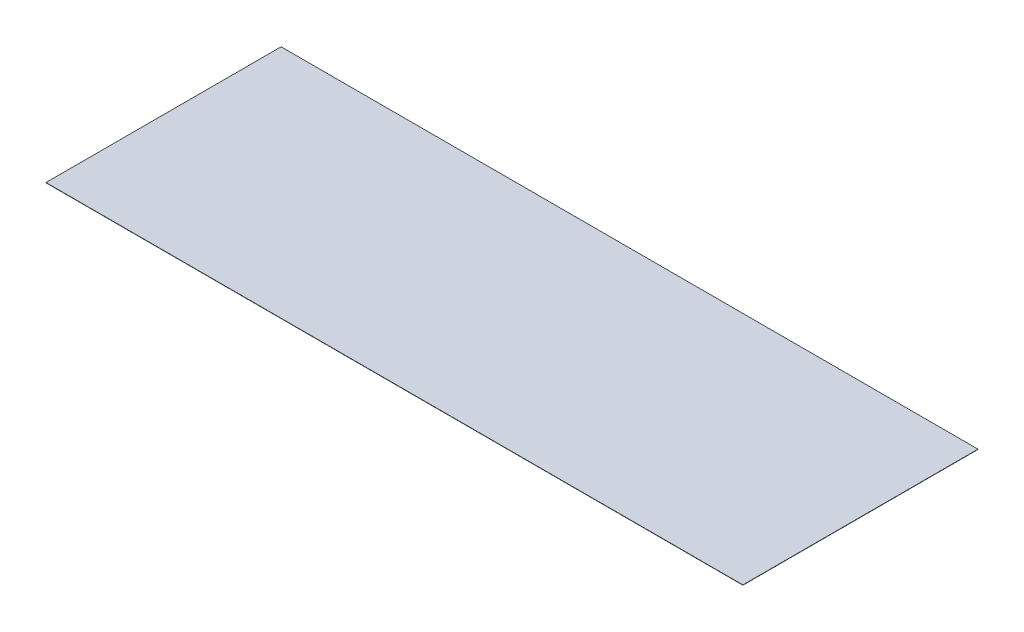
ISO-10303-21;
HEADER;
FILE_DESCRIPTION(('STEP AP214'),'2;1');
FILE_NAME('part.step','',(''),(''),'','','');
FILE_SCHEMA(('AUTOMOTIVE_DESIGN { 1 0 10303 214 1 1 1 1 }'));
ENDSEC;
DATA;
#1=APPLICATION_CONTEXT('core data for automotive mechanical design processes');
#2=APPLICATION_PROTOCOL_DEFINITION('international standard','automotive_design',2000,#1);
#3=PRODUCT_CONTEXT('',#1,'mechanical');
#4=PRODUCT('Part','Part','',(#3));
#5=PRODUCT_RELATED_PRODUCT_CATEGORY('part','',(#4));
#6=PRODUCT_DEFINITION_FORMATION('','',#4);
#7=PRODUCT_DEFINITION_CONTEXT('part definition',#1,'design');
#8=PRODUCT_DEFINITION('design','',#6,#7);
#9=PRODUCT_DEFINITION_SHAPE('','',#8);
#10=(LENGTH_UNIT() NAMED_UNIT(*) SI_UNIT(.MILLI.,.METRE.));
#11=(NAMED_UNIT(*) PLANE_ANGLE_UNIT() SI_UNIT($,.RADIAN.));
#12=(NAMED_UNIT(*) SI_UNIT($,.STERADIAN.) SOLID_ANGLE_UNIT());
#13=UNCERTAINTY_MEASURE_WITH_UNIT(LENGTH_MEASURE(1.E-05),#10,'distance_accuracy_value','');
#14=(GEOMETRIC_REPRESENTATION_CONTEXT(3) GLOBAL_UNCERTAINTY_ASSIGNED_CONTEXT((#13)) GLOBAL_UNIT_ASSIGNED_CONTEXT((#10,
#11,#12)) REPRESENTATION_CONTEXT('',''));
#15=CARTESIAN_POINT('',(0.,0.,0.));
#16=DIRECTION('',(0.,0.,1.));
#17=DIRECTION('',(1.,0.,0.));
#18=AXIS2_PLACEMENT_3D('',#15,#16,#17);
#19=CARTESIAN_POINT('',(0.,0.127,0.));
#20=DIRECTION('',(-1.,0.,0.));
#21=DIRECTION('',(0.,0.,1.));
#22=AXIS2_PLACEMENT_3D('',#19,#20,#21);
#23=PLANE('',#22);
#24=DIRECTION('',(0.,0.,-1.));
#25=VECTOR('',#24,1.);
#26=CARTESIAN_POINT('',(0.,0.,0.));
#27=LINE('',#26,#25);
#28=CARTESIAN_POINT('',(0.,0.,0.));
#29=VERTEX_POINT('',#28);
#30=CARTESIAN_POINT('',(0.,0.,-102.816012006538));
#31=VERTEX_POINT('',#30);
#32=EDGE_CURVE('E11',#29,#31,#27,.T.);
#33=ORIENTED_EDGE('',*,*,#32,.T.);
#34=DIRECTION('',(0.,-1.,0.));
#35=VECTOR('',#34,1.);
#36=CARTESIAN_POINT('',(0.,0.127,-102.816012006538));
#37=LINE('',#36,#35);
#38=CARTESIAN_POINT('',(0.,0.127,-102.816012006538));
#39=VERTEX_POINT('',#38);
#40=EDGE_CURVE('E36',#39,#31,#37,.T.);
#41=ORIENTED_EDGE('',*,*,#40,.F.);
#42=DIRECTION('',(0.,0.,-1.));
#43=VECTOR('',#42,1.);
#44=CARTESIAN_POINT('',(0.,0.127,0.));
#45=LINE('',#44,#43);
#46=CARTESIAN_POINT('',(0.,0.127,0.));
#47=VERTEX_POINT('',#46);
#48=EDGE_CURVE('E73',#47,#39,#45,.T.);
#49=ORIENTED_EDGE('',*,*,#48,.F.);
#50=DIRECTION('',(0.,-1.,0.));
#51=VECTOR('',#50,1.);
#52=CARTESIAN_POINT('',(0.,0.127,0.));
#53=LINE('',#52,#51);
#54=EDGE_CURVE('E27',#47,#29,#53,.T.);
#55=ORIENTED_EDGE('',*,*,#54,.T.);
#56=EDGE_LOOP('',(#33,#41,#49,#55));
#57=FACE_BOUND('',#56,.T.);
#58=ADVANCED_FACE('F17',(#57),#23,.F.);
#59=CARTESIAN_POINT('',(0.,0.127,-102.816012006538));
#60=DIRECTION('',(0.,0.,1.));
#61=DIRECTION('',(1.,0.,0.));
#62=AXIS2_PLACEMENT_3D('',#59,#60,#61);
#63=PLANE('',#62);
#64=DIRECTION('',(-1.,0.,0.));
#65=VECTOR('',#64,1.);
#66=CARTESIAN_POINT('',(0.,0.,-102.816012006538));
#67=LINE('',#66,#65);
#68=CARTESIAN_POINT('',(-304.8,0.,-102.816012006538));
#69=VERTEX_POINT('',#68);
#70=EDGE_CURVE('E80',#31,#69,#67,.T.);
#71=ORIENTED_EDGE('',*,*,#70,.T.);
#72=DIRECTION('',(0.,-1.,0.));
#73=VECTOR('',#72,1.);
#74=CARTESIAN_POINT('',(-304.8,0.127,-102.816012006538));
#75=LINE('',#74,#73);
#76=CARTESIAN_POINT('',(-304.8,0.127,-102.816012006538));
#77=VERTEX_POINT('',#76);
#78=EDGE_CURVE('E86',#77,#69,#75,.T.);
#79=ORIENTED_EDGE('',*,*,#78,.F.);
#80=DIRECTION('',(-1.,0.,0.));
#81=VECTOR('',#80,1.);
#82=CARTESIAN_POINT('',(0.,0.127,-102.816012006538));
#83=LINE('',#82,#81);
#84=EDGE_CURVE('E64',#39,#77,#83,.T.);
#85=ORIENTED_EDGE('',*,*,#84,.F.);
#86=ORIENTED_EDGE('',*,*,#40,.T.);
#87=EDGE_LOOP('',(#71,#79,#85,#86));
#88=FACE_BOUND('',#87,.T.);
#89=ADVANCED_FACE('F90',(#88),#63,.F.);
#90=CARTESIAN_POINT('',(-304.8,0.127,0.));
#91=DIRECTION('',(1.,0.,0.));
#92=DIRECTION('',(0.,0.,-1.));
#93=AXIS2_PLACEMENT_3D('',#90,#91,#92);
#94=PLANE('',#93);
#95=DIRECTION('',(0.,0.,1.));
#96=VECTOR('',#95,1.);
#97=CARTESIAN_POINT('',(-304.8,0.,0.));
#98=LINE('',#97,#96);
#99=CARTESIAN_POINT('',(-304.8,0.,0.));
#100=VERTEX_POINT('',#99);
#101=EDGE_CURVE('E70',#69,#100,#98,.T.);
#102=ORIENTED_EDGE('',*,*,#101,.T.);
#103=DIRECTION('',(0.,-1.,0.));
#104=VECTOR('',#103,1.);
#105=CARTESIAN_POINT('',(-304.8,0.127,0.));
#106=LINE('',#105,#104);
#107=CARTESIAN_POINT('',(-304.8,0.127,0.));
#108=VERTEX_POINT('',#107);
#109=EDGE_CURVE('E56',#108,#100,#106,.T.);
#110=ORIENTED_EDGE('',*,*,#109,.F.);
#111=DIRECTION('',(0.,0.,1.));
#112=VECTOR('',#111,1.);
#113=CARTESIAN_POINT('',(-304.8,0.127,0.));
#114=LINE('',#113,#112);
#115=EDGE_CURVE('E62',#77,#108,#114,.T.);
#116=ORIENTED_EDGE('',*,*,#115,.F.);
#117=ORIENTED_EDGE('',*,*,#78,.T.);
#118=EDGE_LOOP('',(#102,#110,#116,#117));
#119=FACE_BOUND('',#118,.T.);
#120=ADVANCED_FACE('F68',(#119),#94,.F.);
#121=CARTESIAN_POINT('',(0.,0.127,0.));
#122=DIRECTION('',(0.,0.,-1.));
#123=DIRECTION('',(-1.,0.,0.));
#124=AXIS2_PLACEMENT_3D('',#121,#122,#123);
#125=PLANE('',#124);
#126=DIRECTION('',(1.,0.,0.));
#127=VECTOR('',#126,1.);
#128=CARTESIAN_POINT('',(0.,0.,0.));
#129=LINE('',#128,#127);
#130=EDGE_CURVE('E72',#100,#29,#129,.T.);
#131=ORIENTED_EDGE('',*,*,#130,.T.);
#132=ORIENTED_EDGE('',*,*,#54,.F.);
#133=DIRECTION('',(1.,0.,0.));
#134=VECTOR('',#133,1.);
#135=CARTESIAN_POINT('',(0.,0.127,0.));
#136=LINE('',#135,#134);
#137=EDGE_CURVE('E21',#108,#47,#136,.T.);
#138=ORIENTED_EDGE('',*,*,#137,.F.);
#139=ORIENTED_EDGE('',*,*,#109,.T.);
#140=EDGE_LOOP('',(#131,#132,#138,#139));
#141=FACE_BOUND('',#140,.T.);
#142=ADVANCED_FACE('F76',(#141),#125,.F.);
#143=CARTESIAN_POINT('',(0.,0.127,0.));
#144=DIRECTION('',(0.,1.,0.));
#145=DIRECTION('',(0.,0.,1.));
#146=AXIS2_PLACEMENT_3D('',#143,#144,#145);
#147=PLANE('',#146);
#148=ORIENTED_EDGE('',*,*,#48,.T.);
#149=ORIENTED_EDGE('',*,*,#84,.T.);
#150=ORIENTED_EDGE('',*,*,#115,.T.);
#151=ORIENTED_EDGE('',*,*,#137,.T.);
#152=EDGE_LOOP('',(#148,#149,#150,#151));
#153=FACE_BOUND('',#152,.T.);
#154=ADVANCED_FACE('F63',(#153),#147,.T.);
#155=CARTESIAN_POINT('',(0.,0.,0.));
#156=DIRECTION('',(0.,1.,0.));
#157=DIRECTION('',(0.,0.,1.));
#158=AXIS2_PLACEMENT_3D('',#155,#156,#157);
#159=PLANE('',#158);
#160=ORIENTED_EDGE('',*,*,#32,.F.);
#161=ORIENTED_EDGE('',*,*,#130,.F.);
#162=ORIENTED_EDGE('',*,*,#101,.F.);
#163=ORIENTED_EDGE('',*,*,#70,.F.);
#164=EDGE_LOOP('',(#160,#161,#162,#163));
#165=FACE_BOUND('',#164,.T.);
#166=ADVANCED_FACE('F19',(#165),#159,.F.);
#167=CLOSED_SHELL('',(#58,#89,#120,#142,#154,#166));
#168=MANIFOLD_SOLID_BREP('B1',#167);
#169=ADVANCED_BREP_SHAPE_REPRESENTATION('',(#18,#168),#14);
#170=SHAPE_DEFINITION_REPRESENTATION(#9,#169);
ENDSEC;
END-ISO-10303-21;
